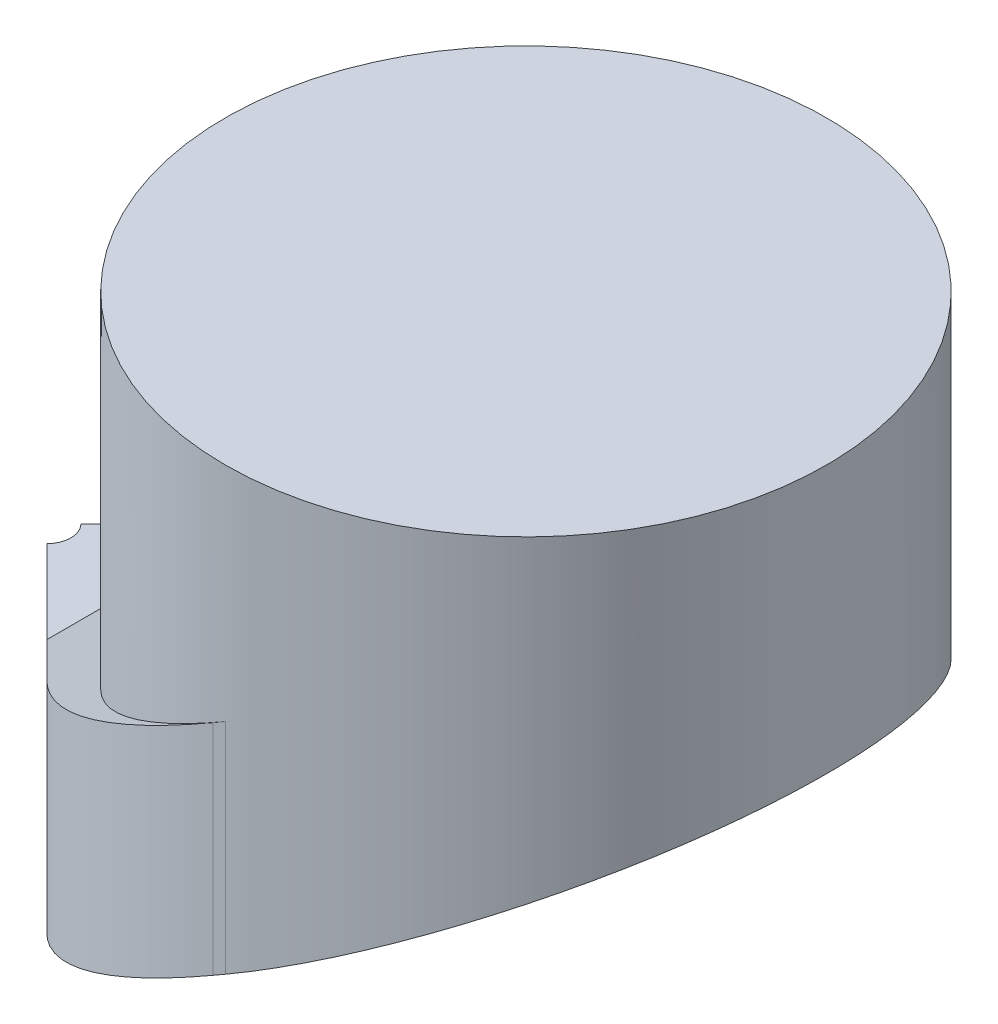
ISO-10303-21;
HEADER;
FILE_DESCRIPTION(('STEP AP214'),'2;1');
FILE_NAME('part.step','',(''),(''),'','','');
FILE_SCHEMA(('AUTOMOTIVE_DESIGN { 1 0 10303 214 1 1 1 1 }'));
ENDSEC;
DATA;
#1=APPLICATION_CONTEXT('core data for automotive mechanical design processes');
#2=APPLICATION_PROTOCOL_DEFINITION('international standard','automotive_design',2000,#1);
#3=PRODUCT_CONTEXT('',#1,'mechanical');
#4=PRODUCT('Part','Part','',(#3));
#5=PRODUCT_RELATED_PRODUCT_CATEGORY('part','',(#4));
#6=PRODUCT_DEFINITION_FORMATION('','',#4);
#7=PRODUCT_DEFINITION_CONTEXT('part definition',#1,'design');
#8=PRODUCT_DEFINITION('design','',#6,#7);
#9=PRODUCT_DEFINITION_SHAPE('','',#8);
#10=(LENGTH_UNIT() NAMED_UNIT(*) SI_UNIT(.MILLI.,.METRE.));
#11=(NAMED_UNIT(*) PLANE_ANGLE_UNIT() SI_UNIT($,.RADIAN.));
#12=(NAMED_UNIT(*) SI_UNIT($,.STERADIAN.) SOLID_ANGLE_UNIT());
#13=UNCERTAINTY_MEASURE_WITH_UNIT(LENGTH_MEASURE(1.E-05),#10,'distance_accuracy_value','');
#14=(GEOMETRIC_REPRESENTATION_CONTEXT(3) GLOBAL_UNCERTAINTY_ASSIGNED_CONTEXT((#13)) GLOBAL_UNIT_ASSIGNED_CONTEXT((#10,
#11,#12)) REPRESENTATION_CONTEXT('',''));
#15=CARTESIAN_POINT('',(0.,0.,0.));
#16=DIRECTION('',(0.,0.,1.));
#17=DIRECTION('',(1.,0.,0.));
#18=AXIS2_PLACEMENT_3D('',#15,#16,#17);
#19=CARTESIAN_POINT('',(239.023011444508,-319.081008634281,0.));
#20=DIRECTION('',(0.,1.,0.));
#21=DIRECTION('',(0.,0.,1.));
#22=AXIS2_PLACEMENT_3D('',#19,#20,#21);
#23=CYLINDRICAL_SURFACE('',#22,150.);
#24=CARTESIAN_POINT('',(239.023011444508,358.,0.));
#25=DIRECTION('',(0.,1.,0.));
#26=DIRECTION('',(0.,0.,1.));
#27=AXIS2_PLACEMENT_3D('',#24,#25,#26);
#28=CIRCLE('',#27,150.);
#29=CARTESIAN_POINT('',(239.023011444508,358.,150.));
#30=VERTEX_POINT('',#29);
#31=EDGE_CURVE('E116',#30,#30,#28,.T.);
#32=ORIENTED_EDGE('',*,*,#31,.F.);
#33=EDGE_LOOP('',(#32));
#34=FACE_BOUND('',#33,.T.);
#35=CARTESIAN_POINT('',(239.023011444508,247.159437940572,0.));
#36=DIRECTION('',(0.499999999999995,-0.866025403784442,0.));
#37=DIRECTION('',(0.866025403784442,0.499999999999995,0.));
#38=AXIS2_PLACEMENT_3D('',#35,#36,#37);
#39=ELLIPSE('',#38,173.205080756887,150.);
#40=CARTESIAN_POINT('',(239.023011444508,247.159437940572,-150.));
#41=VERTEX_POINT('',#40);
#42=CARTESIAN_POINT('',(239.023011444508,247.159437940572,150.));
#43=VERTEX_POINT('',#42);
#44=EDGE_CURVE('E142',#41,#43,#39,.F.);
#45=ORIENTED_EDGE('',*,*,#44,.T.);
#46=DIRECTION('',(0.,-1.,0.));
#47=VECTOR('',#46,1.);
#48=CARTESIAN_POINT('',(239.023011444508,247.159437940572,150.));
#49=LINE('',#48,#47);
#50=CARTESIAN_POINT('',(239.023011444508,138.,150.));
#51=VERTEX_POINT('',#50);
#52=EDGE_CURVE('E140',#43,#51,#49,.T.);
#53=ORIENTED_EDGE('',*,*,#52,.T.);
#54=CARTESIAN_POINT('',(239.023011444508,138.,0.));
#55=DIRECTION('',(0.499999999999995,-0.866025403784442,0.));
#56=DIRECTION('',(0.866025403784442,0.499999999999995,0.));
#57=AXIS2_PLACEMENT_3D('',#54,#55,#56);
#58=ELLIPSE('',#57,173.205080756887,150.);
#59=CARTESIAN_POINT('',(239.023011444508,138.,-150.));
#60=VERTEX_POINT('',#59);
#61=EDGE_CURVE('E146',#51,#60,#58,.F.);
#62=ORIENTED_EDGE('',*,*,#61,.T.);
#63=DIRECTION('',(0.,-1.,0.));
#64=VECTOR('',#63,1.);
#65=CARTESIAN_POINT('',(239.023011444508,247.159437940572,-150.));
#66=LINE('',#65,#64);
#67=EDGE_CURVE('E139',#41,#60,#66,.T.);
#68=ORIENTED_EDGE('',*,*,#67,.F.);
#69=EDGE_LOOP('',(#45,#53,#62,#68));
#70=FACE_BOUND('',#69,.T.);
#71=ADVANCED_FACE('F37',(#34,#70),#23,.T.);
#72=CARTESIAN_POINT('',(0.,138.,0.));
#73=DIRECTION('',(0.,1.,0.));
#74=DIRECTION('',(0.,0.,1.));
#75=AXIS2_PLACEMENT_3D('',#72,#73,#74);
#76=PLANE('',#75);
#77=DIRECTION('',(0.707106781186543,0.,0.707106781186551));
#78=VECTOR('',#77,1.);
#79=CARTESIAN_POINT('',(150.,138.,150.000000000002));
#80=LINE('',#79,#78);
#81=CARTESIAN_POINT('',(8.48528137423857,138.,8.48528137423859));
#82=VERTEX_POINT('',#81);
#83=CARTESIAN_POINT('',(49.9533188057734,138.,49.9533188057738));
#84=VERTEX_POINT('',#83);
#85=EDGE_CURVE('E150',#82,#84,#80,.T.);
#86=ORIENTED_EDGE('',*,*,#85,.T.);
#87=DIRECTION('',(0.,0.,-1.));
#88=VECTOR('',#87,1.);
#89=CARTESIAN_POINT('',(49.9533188057734,138.,0.));
#90=LINE('',#89,#88);
#91=CARTESIAN_POINT('',(49.9533188057734,138.,-49.953318805774));
#92=VERTEX_POINT('',#91);
#93=EDGE_CURVE('E12',#84,#92,#90,.T.);
#94=ORIENTED_EDGE('',*,*,#93,.T.);
#95=DIRECTION('',(-0.707106781186544,0.,0.707106781186551));
#96=VECTOR('',#95,1.);
#97=CARTESIAN_POINT('',(8.48528137423848,138.,-8.48528137423866));
#98=LINE('',#97,#96);
#99=CARTESIAN_POINT('',(8.48528137423848,138.,-8.48528137423866));
#100=VERTEX_POINT('',#99);
#101=EDGE_CURVE('E121',#92,#100,#98,.T.);
#102=ORIENTED_EDGE('',*,*,#101,.T.);
#103=CARTESIAN_POINT('',(0.,138.,0.));
#104=DIRECTION('',(0.,-1.,0.));
#105=DIRECTION('',(0.,0.,1.));
#106=AXIS2_PLACEMENT_3D('',#103,#104,#105);
#107=CIRCLE('',#106,12.);
#108=EDGE_CURVE('E166',#100,#82,#107,.T.);
#109=ORIENTED_EDGE('',*,*,#108,.T.);
#110=EDGE_LOOP('',(#86,#94,#102,#109));
#111=FACE_BOUND('',#110,.T.);
#112=ADVANCED_FACE('F190',(#111),#76,.T.);
#113=CARTESIAN_POINT('',(239.023011444508,138.,-150.));
#114=DIRECTION('',(0.499999999999995,-0.866025403784442,0.));
#115=DIRECTION('',(0.866025403784442,0.499999999999995,0.));
#116=AXIS2_PLACEMENT_3D('',#113,#114,#115);
#117=PLANE('',#116);
#118=DIRECTION('',(0.654653670707976,0.377964473009221,-0.654653670707982));
#119=VECTOR('',#118,1.);
#120=CARTESIAN_POINT('',(41.4192428128474,23.9134109876276,-41.4192428128479));
#121=LINE('',#120,#119);
#122=CARTESIAN_POINT('',(8.48528137423848,4.89897948556622,-8.48528137423866));
#123=VERTEX_POINT('',#122);
#124=CARTESIAN_POINT('',(91.4213562373083,52.7821446332899,-91.4213562373094));
#125=VERTEX_POINT('',#124);
#126=EDGE_CURVE('E162',#123,#125,#121,.T.);
#127=ORIENTED_EDGE('',*,*,#126,.T.);
#128=CARTESIAN_POINT('',(232.842712474619,134.431802726062,49.9999999999994));
#129=DIRECTION('',(0.499999999999995,-0.866025403784442,0.));
#130=DIRECTION('',(-0.866025403784442,-0.499999999999995,0.));
#131=AXIS2_PLACEMENT_3D('',#128,#129,#130);
#132=ELLIPSE('',#131,230.94010767585,200.);
#133=CARTESIAN_POINT('',(232.842712474621,134.431802726063,-150.000000000001));
#134=VERTEX_POINT('',#133);
#135=EDGE_CURVE('E59',#125,#134,#132,.T.);
#136=ORIENTED_EDGE('',*,*,#135,.T.);
#137=DIRECTION('',(0.866025403784442,0.499999999999995,0.));
#138=VECTOR('',#137,1.);
#139=CARTESIAN_POINT('',(172.255752861127,99.4519052838318,-150.000000000001));
#140=LINE('',#139,#138);
#141=EDGE_CURVE('E152',#134,#60,#140,.T.);
#142=ORIENTED_EDGE('',*,*,#141,.T.);
#143=ORIENTED_EDGE('',*,*,#61,.F.);
#144=DIRECTION('',(-0.866025403784442,-0.499999999999995,0.));
#145=VECTOR('',#144,1.);
#146=CARTESIAN_POINT('',(268.939015991675,155.272013278385,150.));
#147=LINE('',#146,#145);
#148=CARTESIAN_POINT('',(232.842712474621,134.431802726063,150.000000000001));
#149=VERTEX_POINT('',#148);
#150=EDGE_CURVE('E153',#51,#149,#147,.T.);
#151=ORIENTED_EDGE('',*,*,#150,.T.);
#152=CARTESIAN_POINT('',(232.842712474619,134.431802726062,-49.9999999999995));
#153=DIRECTION('',(0.499999999999995,-0.866025403784442,0.));
#154=DIRECTION('',(-0.866025403784442,-0.499999999999995,0.));
#155=AXIS2_PLACEMENT_3D('',#152,#153,#154);
#156=ELLIPSE('',#155,230.94010767585,200.);
#157=CARTESIAN_POINT('',(91.4213562373083,52.7821446332899,91.4213562373093));
#158=VERTEX_POINT('',#157);
#159=EDGE_CURVE('E115',#149,#158,#156,.T.);
#160=ORIENTED_EDGE('',*,*,#159,.T.);
#161=DIRECTION('',(-0.654653670707975,-0.377964473009221,-0.654653670707983));
#162=VECTOR('',#161,1.);
#163=CARTESIAN_POINT('',(162.717573063501,93.9450346100935,162.717573063502));
#164=LINE('',#163,#162);
#165=CARTESIAN_POINT('',(8.48528137423857,4.89897948556629,8.48528137423859));
#166=VERTEX_POINT('',#165);
#167=EDGE_CURVE('E156',#158,#166,#164,.T.);
#168=ORIENTED_EDGE('',*,*,#167,.T.);
#169=CARTESIAN_POINT('',(0.,0.,0.));
#170=DIRECTION('',(0.499999999999995,-0.866025403784442,0.));
#171=DIRECTION('',(-0.866025403784442,-0.499999999999995,0.));
#172=AXIS2_PLACEMENT_3D('',#169,#170,#171);
#173=ELLIPSE('',#172,13.856406460551,12.);
#174=EDGE_CURVE('E159',#166,#123,#173,.F.);
#175=ORIENTED_EDGE('',*,*,#174,.T.);
#176=EDGE_LOOP('',(#127,#136,#142,#143,#151,#160,#168,#175));
#177=FACE_BOUND('',#176,.T.);
#178=ADVANCED_FACE('F195',(#177),#117,.T.);
#179=CARTESIAN_POINT('',(150.,138.,150.000000000002));
#180=DIRECTION('',(0.707106781186552,0.,-0.707106781186544));
#181=DIRECTION('',(-0.707106781186544,0.,-0.707106781186552));
#182=AXIS2_PLACEMENT_3D('',#179,#180,#181);
#183=PLANE('',#182);
#184=DIRECTION('',(0.,-1.,0.));
#185=VECTOR('',#184,1.);
#186=CARTESIAN_POINT('',(91.4213562373083,138.,91.4213562373092));
#187=LINE('',#186,#185);
#188=CARTESIAN_POINT('',(91.4213562373083,161.941582573862,91.4213562373092));
#189=VERTEX_POINT('',#188);
#190=EDGE_CURVE('E45',#158,#189,#187,.F.);
#191=ORIENTED_EDGE('',*,*,#190,.T.);
#192=DIRECTION('',(-0.654653670707975,-0.377964473009221,-0.654653670707982));
#193=VECTOR('',#192,1.);
#194=CARTESIAN_POINT('',(91.4213562373083,161.941582573862,91.4213562373092));
#195=LINE('',#194,#193);
#196=EDGE_CURVE('E136',#189,#84,#195,.T.);
#197=ORIENTED_EDGE('',*,*,#196,.T.);
#198=ORIENTED_EDGE('',*,*,#85,.F.);
#199=DIRECTION('',(0.,-1.,0.));
#200=VECTOR('',#199,1.);
#201=CARTESIAN_POINT('',(8.48528137423857,138.,8.48528137423859));
#202=LINE('',#201,#200);
#203=EDGE_CURVE('E147',#82,#166,#202,.T.);
#204=ORIENTED_EDGE('',*,*,#203,.T.);
#205=ORIENTED_EDGE('',*,*,#167,.F.);
#206=EDGE_LOOP('',(#191,#197,#198,#204,#205));
#207=FACE_BOUND('',#206,.T.);
#208=ADVANCED_FACE('F183',(#207),#183,.F.);
#209=CARTESIAN_POINT('',(0.,138.,0.));
#210=DIRECTION('',(0.,-1.,0.));
#211=DIRECTION('',(0.,0.,-1.));
#212=AXIS2_PLACEMENT_3D('',#209,#210,#211);
#213=CYLINDRICAL_SURFACE('',#212,12.);
#214=ORIENTED_EDGE('',*,*,#174,.F.);
#215=ORIENTED_EDGE('',*,*,#203,.F.);
#216=ORIENTED_EDGE('',*,*,#108,.F.);
#217=DIRECTION('',(0.,-1.,0.));
#218=VECTOR('',#217,1.);
#219=CARTESIAN_POINT('',(8.48528137423848,138.,-8.48528137423866));
#220=LINE('',#219,#218);
#221=EDGE_CURVE('E149',#100,#123,#220,.T.);
#222=ORIENTED_EDGE('',*,*,#221,.T.);
#223=EDGE_LOOP('',(#214,#215,#216,#222));
#224=FACE_BOUND('',#223,.T.);
#225=ADVANCED_FACE('F196',(#224),#213,.F.);
#226=CARTESIAN_POINT('',(8.48528137423848,138.,-8.48528137423866));
#227=DIRECTION('',(0.707106781186551,0.,0.707106781186544));
#228=DIRECTION('',(0.707106781186544,0.,-0.707106781186551));
#229=AXIS2_PLACEMENT_3D('',#226,#227,#228);
#230=PLANE('',#229);
#231=ORIENTED_EDGE('',*,*,#126,.F.);
#232=ORIENTED_EDGE('',*,*,#221,.F.);
#233=ORIENTED_EDGE('',*,*,#101,.F.);
#234=DIRECTION('',(0.654653670707976,0.377964473009221,-0.654653670707982));
#235=VECTOR('',#234,1.);
#236=CARTESIAN_POINT('',(8.48528137423848,114.058417426138,-8.48528137423866));
#237=LINE('',#236,#235);
#238=CARTESIAN_POINT('',(91.4213562373083,161.941582573862,-91.4213562373094));
#239=VERTEX_POINT('',#238);
#240=EDGE_CURVE('E52',#92,#239,#237,.T.);
#241=ORIENTED_EDGE('',*,*,#240,.T.);
#242=DIRECTION('',(0.,-1.,0.));
#243=VECTOR('',#242,1.);
#244=CARTESIAN_POINT('',(91.4213562373083,138.,-91.4213562373094));
#245=LINE('',#244,#243);
#246=EDGE_CURVE('E109',#239,#125,#245,.T.);
#247=ORIENTED_EDGE('',*,*,#246,.T.);
#248=EDGE_LOOP('',(#231,#232,#233,#241,#247));
#249=FACE_BOUND('',#248,.T.);
#250=ADVANCED_FACE('F119',(#249),#230,.F.);
#251=CARTESIAN_POINT('',(150.,138.,-150.000000000002));
#252=DIRECTION('',(0.,0.,1.));
#253=DIRECTION('',(1.,0.,0.));
#254=AXIS2_PLACEMENT_3D('',#251,#252,#253);
#255=PLANE('',#254);
#256=ORIENTED_EDGE('',*,*,#141,.F.);
#257=DIRECTION('',(0.,-1.,0.));
#258=VECTOR('',#257,1.);
#259=CARTESIAN_POINT('',(232.842712474621,138.,-150.000000000001));
#260=LINE('',#259,#258);
#261=CARTESIAN_POINT('',(232.842712474621,243.591240666635,-150.000000000001));
#262=VERTEX_POINT('',#261);
#263=EDGE_CURVE('E176',#134,#262,#260,.F.);
#264=ORIENTED_EDGE('',*,*,#263,.T.);
#265=DIRECTION('',(0.866025403784441,0.499999999999996,0.));
#266=VECTOR('',#265,1.);
#267=CARTESIAN_POINT('',(232.842712474621,243.591240666635,-150.000000000001));
#268=LINE('',#267,#266);
#269=EDGE_CURVE('E126',#262,#41,#268,.T.);
#270=ORIENTED_EDGE('',*,*,#269,.T.);
#271=ORIENTED_EDGE('',*,*,#67,.T.);
#272=EDGE_LOOP('',(#256,#264,#270,#271));
#273=FACE_BOUND('',#272,.T.);
#274=ADVANCED_FACE('F203',(#273),#255,.F.);
#275=CARTESIAN_POINT('',(278.911017507397,138.,150.));
#276=DIRECTION('',(0.,0.,-1.));
#277=DIRECTION('',(-1.,0.,0.));
#278=AXIS2_PLACEMENT_3D('',#275,#276,#277);
#279=PLANE('',#278);
#280=ORIENTED_EDGE('',*,*,#150,.F.);
#281=ORIENTED_EDGE('',*,*,#52,.F.);
#282=DIRECTION('',(-0.866025403784441,-0.499999999999995,0.));
#283=VECTOR('',#282,1.);
#284=CARTESIAN_POINT('',(239.023011444508,247.159437940572,150.));
#285=LINE('',#284,#283);
#286=CARTESIAN_POINT('',(232.842712474621,243.591240666635,150.000000000001));
#287=VERTEX_POINT('',#286);
#288=EDGE_CURVE('E128',#43,#287,#285,.T.);
#289=ORIENTED_EDGE('',*,*,#288,.T.);
#290=DIRECTION('',(0.,-1.,0.));
#291=VECTOR('',#290,1.);
#292=CARTESIAN_POINT('',(232.842712474621,138.,150.000000000001));
#293=LINE('',#292,#291);
#294=EDGE_CURVE('E178',#287,#149,#293,.T.);
#295=ORIENTED_EDGE('',*,*,#294,.T.);
#296=EDGE_LOOP('',(#280,#281,#289,#295));
#297=FACE_BOUND('',#296,.T.);
#298=ADVANCED_FACE('F223',(#297),#279,.F.);
#299=CARTESIAN_POINT('',(239.023011444508,358.,0.));
#300=DIRECTION('',(0.,1.,0.));
#301=DIRECTION('',(0.,0.,1.));
#302=AXIS2_PLACEMENT_3D('',#299,#300,#301);
#303=PLANE('',#302);
#304=ORIENTED_EDGE('',*,*,#31,.T.);
#305=EDGE_LOOP('',(#304));
#306=FACE_BOUND('',#305,.T.);
#307=ADVANCED_FACE('F218',(#306),#303,.T.);
#308=CARTESIAN_POINT('',(232.842712474619,138.,49.9999999999994));
#309=DIRECTION('',(0.,-1.,0.));
#310=DIRECTION('',(0.,0.,-1.));
#311=AXIS2_PLACEMENT_3D('',#308,#309,#310);
#312=CYLINDRICAL_SURFACE('',#311,200.);
#313=ORIENTED_EDGE('',*,*,#246,.F.);
#314=CARTESIAN_POINT('',(232.842712474619,243.591240666634,49.9999999999994));
#315=DIRECTION('',(0.499999999999995,-0.866025403784442,0.));
#316=DIRECTION('',(-0.866025403784442,-0.499999999999995,0.));
#317=AXIS2_PLACEMENT_3D('',#314,#315,#316);
#318=ELLIPSE('',#317,230.94010767585,200.);
#319=EDGE_CURVE('E112',#239,#262,#318,.T.);
#320=ORIENTED_EDGE('',*,*,#319,.T.);
#321=ORIENTED_EDGE('',*,*,#263,.F.);
#322=ORIENTED_EDGE('',*,*,#135,.F.);
#323=EDGE_LOOP('',(#313,#320,#321,#322));
#324=FACE_BOUND('',#323,.T.);
#325=ADVANCED_FACE('F110',(#324),#312,.T.);
#326=CARTESIAN_POINT('',(232.842712474619,138.,-49.9999999999995));
#327=DIRECTION('',(0.,-1.,0.));
#328=DIRECTION('',(0.,0.,-1.));
#329=AXIS2_PLACEMENT_3D('',#326,#327,#328);
#330=CYLINDRICAL_SURFACE('',#329,200.);
#331=ORIENTED_EDGE('',*,*,#294,.F.);
#332=CARTESIAN_POINT('',(232.842712474619,243.591240666634,-49.9999999999995));
#333=DIRECTION('',(0.499999999999995,-0.866025403784442,0.));
#334=DIRECTION('',(-0.866025403784442,-0.499999999999995,0.));
#335=AXIS2_PLACEMENT_3D('',#332,#333,#334);
#336=ELLIPSE('',#335,230.94010767585,200.);
#337=EDGE_CURVE('E133',#287,#189,#336,.T.);
#338=ORIENTED_EDGE('',*,*,#337,.T.);
#339=ORIENTED_EDGE('',*,*,#190,.F.);
#340=ORIENTED_EDGE('',*,*,#159,.F.);
#341=EDGE_LOOP('',(#331,#338,#339,#340));
#342=FACE_BOUND('',#341,.T.);
#343=ADVANCED_FACE('F39',(#342),#330,.T.);
#344=CARTESIAN_POINT('',(0.,109.159437940572,0.));
#345=DIRECTION('',(0.499999999999995,-0.866025403784442,0.));
#346=DIRECTION('',(0.866025403784442,0.499999999999995,0.));
#347=AXIS2_PLACEMENT_3D('',#344,#345,#346);
#348=PLANE('',#347);
#349=ORIENTED_EDGE('',*,*,#44,.F.);
#350=ORIENTED_EDGE('',*,*,#269,.F.);
#351=ORIENTED_EDGE('',*,*,#319,.F.);
#352=ORIENTED_EDGE('',*,*,#240,.F.);
#353=ORIENTED_EDGE('',*,*,#93,.F.);
#354=ORIENTED_EDGE('',*,*,#196,.F.);
#355=ORIENTED_EDGE('',*,*,#337,.F.);
#356=ORIENTED_EDGE('',*,*,#288,.F.);
#357=EDGE_LOOP('',(#349,#350,#351,#352,#353,#354,#355,#356));
#358=FACE_BOUND('',#357,.T.);
#359=ADVANCED_FACE('F124',(#358),#348,.F.);
#360=CLOSED_SHELL('',(#71,#112,#178,#208,#225,#250,#274,#298,#307,#325,#343,#359));
#361=MANIFOLD_SOLID_BREP('B2',#360);
#362=ADVANCED_BREP_SHAPE_REPRESENTATION('',(#18,#361),#14);
#363=SHAPE_DEFINITION_REPRESENTATION(#9,#362);
ENDSEC;
END-ISO-10303-21;
